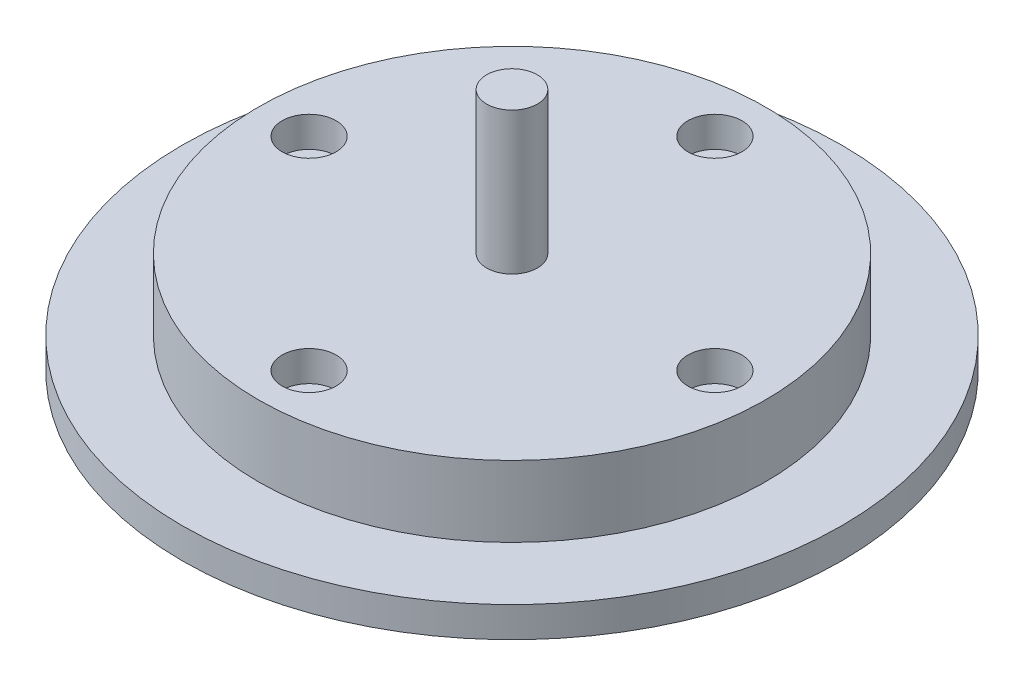
ISO-10303-21;
HEADER;
FILE_DESCRIPTION(('STEP AP214'),'2;1');
FILE_NAME('part.step','',(''),(''),'','','');
FILE_SCHEMA(('AUTOMOTIVE_DESIGN { 1 0 10303 214 1 1 1 1 }'));
ENDSEC;
DATA;
#1=APPLICATION_CONTEXT('core data for automotive mechanical design processes');
#2=APPLICATION_PROTOCOL_DEFINITION('international standard','automotive_design',2000,#1);
#3=PRODUCT_CONTEXT('',#1,'mechanical');
#4=PRODUCT('Part','Part','',(#3));
#5=PRODUCT_RELATED_PRODUCT_CATEGORY('part','',(#4));
#6=PRODUCT_DEFINITION_FORMATION('','',#4);
#7=PRODUCT_DEFINITION_CONTEXT('part definition',#1,'design');
#8=PRODUCT_DEFINITION('design','',#6,#7);
#9=PRODUCT_DEFINITION_SHAPE('','',#8);
#10=(LENGTH_UNIT() NAMED_UNIT(*) SI_UNIT(.MILLI.,.METRE.));
#11=(NAMED_UNIT(*) PLANE_ANGLE_UNIT() SI_UNIT($,.RADIAN.));
#12=(NAMED_UNIT(*) SI_UNIT($,.STERADIAN.) SOLID_ANGLE_UNIT());
#13=UNCERTAINTY_MEASURE_WITH_UNIT(LENGTH_MEASURE(1.E-05),#10,'distance_accuracy_value','');
#14=(GEOMETRIC_REPRESENTATION_CONTEXT(3) GLOBAL_UNCERTAINTY_ASSIGNED_CONTEXT((#13)) GLOBAL_UNIT_ASSIGNED_CONTEXT((#10,
#11,#12)) REPRESENTATION_CONTEXT('',''));
#15=CARTESIAN_POINT('',(0.,0.,0.));
#16=DIRECTION('',(0.,0.,1.));
#17=DIRECTION('',(1.,0.,0.));
#18=AXIS2_PLACEMENT_3D('',#15,#16,#17);
#19=CARTESIAN_POINT('',(0.,7.,-20.));
#20=DIRECTION('',(0.,-1.,0.));
#21=DIRECTION('',(0.,0.,-1.));
#22=AXIS2_PLACEMENT_3D('',#19,#20,#21);
#23=CYLINDRICAL_SURFACE('',#22,1.5);
#24=CARTESIAN_POINT('',(0.,4.,-20.));
#25=DIRECTION('',(0.,1.,0.));
#26=DIRECTION('',(0.,0.,1.));
#27=AXIS2_PLACEMENT_3D('',#24,#25,#26);
#28=CIRCLE('',#27,1.5);
#29=CARTESIAN_POINT('',(0.,4.,-18.5));
#30=VERTEX_POINT('',#29);
#31=EDGE_CURVE('E64',#30,#30,#28,.T.);
#32=ORIENTED_EDGE('',*,*,#31,.T.);
#33=EDGE_LOOP('',(#32));
#34=FACE_BOUND('',#33,.T.);
#35=CARTESIAN_POINT('',(0.,-3.,-20.));
#36=DIRECTION('',(0.,1.,0.));
#37=DIRECTION('',(0.,0.,1.));
#38=AXIS2_PLACEMENT_3D('',#35,#36,#37);
#39=CIRCLE('',#38,1.5);
#40=CARTESIAN_POINT('',(0.,-3.,-18.5));
#41=VERTEX_POINT('',#40);
#42=EDGE_CURVE('E84',#41,#41,#39,.T.);
#43=ORIENTED_EDGE('',*,*,#42,.F.);
#44=EDGE_LOOP('',(#43));
#45=FACE_BOUND('',#44,.T.);
#46=ADVANCED_FACE('F33',(#34,#45),#23,.F.);
#47=CARTESIAN_POINT('',(20.0000000000006,7.,-5.65984895009785E-13));
#48=DIRECTION('',(0.,-1.,0.));
#49=DIRECTION('',(0.,0.,-1.));
#50=AXIS2_PLACEMENT_3D('',#47,#48,#49);
#51=CYLINDRICAL_SURFACE('',#50,1.50000000000044);
#52=CARTESIAN_POINT('',(20.0000000000006,4.,-5.65984895009785E-13));
#53=DIRECTION('',(0.,1.,0.));
#54=DIRECTION('',(0.,0.,1.));
#55=AXIS2_PLACEMENT_3D('',#52,#53,#54);
#56=CIRCLE('',#55,1.50000000000044);
#57=CARTESIAN_POINT('',(20.0000000000006,4.,1.49999999999988));
#58=VERTEX_POINT('',#57);
#59=EDGE_CURVE('E55',#58,#58,#56,.T.);
#60=ORIENTED_EDGE('',*,*,#59,.T.);
#61=EDGE_LOOP('',(#60));
#62=FACE_BOUND('',#61,.T.);
#63=CARTESIAN_POINT('',(20.0000000000006,-3.,-5.65984895009785E-13));
#64=DIRECTION('',(0.,1.,0.));
#65=DIRECTION('',(0.,0.,1.));
#66=AXIS2_PLACEMENT_3D('',#63,#64,#65);
#67=CIRCLE('',#66,1.50000000000044);
#68=CARTESIAN_POINT('',(20.0000000000006,-3.,1.49999999999988));
#69=VERTEX_POINT('',#68);
#70=EDGE_CURVE('E95',#69,#69,#67,.T.);
#71=ORIENTED_EDGE('',*,*,#70,.F.);
#72=EDGE_LOOP('',(#71));
#73=FACE_BOUND('',#72,.T.);
#74=ADVANCED_FACE('F145',(#62,#73),#51,.F.);
#75=CARTESIAN_POINT('',(1.13196979001957E-12,7.,20.));
#76=DIRECTION('',(0.,-1.,0.));
#77=DIRECTION('',(0.,0.,-1.));
#78=AXIS2_PLACEMENT_3D('',#75,#76,#77);
#79=CYLINDRICAL_SURFACE('',#78,1.50000000000122);
#80=CARTESIAN_POINT('',(1.13196979001957E-12,4.,20.));
#81=DIRECTION('',(0.,1.,0.));
#82=DIRECTION('',(0.,0.,1.));
#83=AXIS2_PLACEMENT_3D('',#80,#81,#82);
#84=CIRCLE('',#83,1.50000000000122);
#85=CARTESIAN_POINT('',(1.13196979001957E-12,4.,21.5000000000012));
#86=VERTEX_POINT('',#85);
#87=EDGE_CURVE('E52',#86,#86,#84,.T.);
#88=ORIENTED_EDGE('',*,*,#87,.T.);
#89=EDGE_LOOP('',(#88));
#90=FACE_BOUND('',#89,.T.);
#91=CARTESIAN_POINT('',(1.13196979001957E-12,-3.,20.));
#92=DIRECTION('',(0.,1.,0.));
#93=DIRECTION('',(0.,0.,1.));
#94=AXIS2_PLACEMENT_3D('',#91,#92,#93);
#95=CIRCLE('',#94,1.50000000000122);
#96=CARTESIAN_POINT('',(1.13196979001957E-12,-3.,21.5000000000012));
#97=VERTEX_POINT('',#96);
#98=EDGE_CURVE('E92',#97,#97,#95,.T.);
#99=ORIENTED_EDGE('',*,*,#98,.F.);
#100=EDGE_LOOP('',(#99));
#101=FACE_BOUND('',#100,.T.);
#102=ADVANCED_FACE('F152',(#90,#101),#79,.F.);
#103=CARTESIAN_POINT('',(-19.9999999999994,7.,5.6843418860808E-13));
#104=DIRECTION('',(0.,-1.,0.));
#105=DIRECTION('',(0.,0.,-1.));
#106=AXIS2_PLACEMENT_3D('',#103,#104,#105);
#107=CYLINDRICAL_SURFACE('',#106,1.50000000000091);
#108=CARTESIAN_POINT('',(-19.9999999999994,4.,5.6843418860808E-13));
#109=DIRECTION('',(0.,1.,0.));
#110=DIRECTION('',(0.,0.,1.));
#111=AXIS2_PLACEMENT_3D('',#108,#109,#110);
#112=CIRCLE('',#111,1.50000000000091);
#113=CARTESIAN_POINT('',(-19.9999999999994,4.,1.50000000000148));
#114=VERTEX_POINT('',#113);
#115=EDGE_CURVE('E73',#114,#114,#112,.T.);
#116=ORIENTED_EDGE('',*,*,#115,.T.);
#117=EDGE_LOOP('',(#116));
#118=FACE_BOUND('',#117,.T.);
#119=CARTESIAN_POINT('',(-19.9999999999994,-3.,5.6843418860808E-13));
#120=DIRECTION('',(0.,1.,0.));
#121=DIRECTION('',(0.,0.,1.));
#122=AXIS2_PLACEMENT_3D('',#119,#120,#121);
#123=CIRCLE('',#122,1.50000000000091);
#124=CARTESIAN_POINT('',(-19.9999999999994,-3.,1.50000000000148));
#125=VERTEX_POINT('',#124);
#126=EDGE_CURVE('E89',#125,#125,#123,.T.);
#127=ORIENTED_EDGE('',*,*,#126,.F.);
#128=EDGE_LOOP('',(#127));
#129=FACE_BOUND('',#128,.T.);
#130=ADVANCED_FACE('F117',(#118,#129),#107,.F.);
#131=CARTESIAN_POINT('',(0.,7.,0.));
#132=DIRECTION('',(0.,1.,0.));
#133=DIRECTION('',(0.,0.,1.));
#134=AXIS2_PLACEMENT_3D('',#131,#132,#133);
#135=PLANE('',#134);
#136=CARTESIAN_POINT('',(0.,7.,0.));
#137=DIRECTION('',(0.,1.,0.));
#138=DIRECTION('',(0.,0.,1.));
#139=AXIS2_PLACEMENT_3D('',#136,#137,#138);
#140=CIRCLE('',#139,2.5);
#141=CARTESIAN_POINT('',(0.,7.,2.5));
#142=VERTEX_POINT('',#141);
#143=EDGE_CURVE('E99',#142,#142,#140,.T.);
#144=ORIENTED_EDGE('',*,*,#143,.F.);
#145=EDGE_LOOP('',(#144));
#146=FACE_BOUND('',#145,.T.);
#147=CARTESIAN_POINT('',(-19.9999999999994,7.,5.6843418860808E-13));
#148=DIRECTION('',(0.,1.,0.));
#149=DIRECTION('',(0.,0.,1.));
#150=AXIS2_PLACEMENT_3D('',#147,#148,#149);
#151=CIRCLE('',#150,2.66);
#152=CARTESIAN_POINT('',(-19.9999999999994,7.,2.66000000000057));
#153=VERTEX_POINT('',#152);
#154=EDGE_CURVE('E45',#153,#153,#151,.T.);
#155=ORIENTED_EDGE('',*,*,#154,.F.);
#156=EDGE_LOOP('',(#155));
#157=FACE_BOUND('',#156,.T.);
#158=CARTESIAN_POINT('',(-4.98604561831219E-13,7.,-19.9999999999994));
#159=DIRECTION('',(0.,1.,0.));
#160=DIRECTION('',(0.,0.,1.));
#161=AXIS2_PLACEMENT_3D('',#158,#159,#160);
#162=CIRCLE('',#161,2.66);
#163=CARTESIAN_POINT('',(-4.98604561831219E-13,7.,-17.3399999999994));
#164=VERTEX_POINT('',#163);
#165=EDGE_CURVE('E67',#164,#164,#162,.T.);
#166=ORIENTED_EDGE('',*,*,#165,.F.);
#167=EDGE_LOOP('',(#166));
#168=FACE_BOUND('',#167,.T.);
#169=CARTESIAN_POINT('',(19.9999999999994,7.,-4.28774935054359E-13));
#170=DIRECTION('',(0.,1.,0.));
#171=DIRECTION('',(0.,0.,1.));
#172=AXIS2_PLACEMENT_3D('',#169,#170,#171);
#173=CIRCLE('',#172,2.66);
#174=CARTESIAN_POINT('',(19.9999999999994,7.,2.65999999999957));
#175=VERTEX_POINT('',#174);
#176=EDGE_CURVE('E58',#175,#175,#173,.T.);
#177=ORIENTED_EDGE('',*,*,#176,.F.);
#178=EDGE_LOOP('',(#177));
#179=FACE_BOUND('',#178,.T.);
#180=CARTESIAN_POINT('',(3.55475861325544E-13,7.,19.9999999999994));
#181=DIRECTION('',(0.,1.,0.));
#182=DIRECTION('',(0.,0.,1.));
#183=AXIS2_PLACEMENT_3D('',#180,#181,#182);
#184=CIRCLE('',#183,2.66);
#185=CARTESIAN_POINT('',(3.55475861325544E-13,7.,22.6599999999994));
#186=VERTEX_POINT('',#185);
#187=EDGE_CURVE('E48',#186,#186,#184,.T.);
#188=ORIENTED_EDGE('',*,*,#187,.F.);
#189=EDGE_LOOP('',(#188));
#190=FACE_BOUND('',#189,.T.);
#191=CARTESIAN_POINT('',(0.,7.,0.));
#192=DIRECTION('',(0.,1.,0.));
#193=DIRECTION('',(0.,0.,1.));
#194=AXIS2_PLACEMENT_3D('',#191,#192,#193);
#195=CIRCLE('',#194,25.);
#196=CARTESIAN_POINT('',(0.,7.,25.));
#197=VERTEX_POINT('',#196);
#198=EDGE_CURVE('E10',#197,#197,#195,.T.);
#199=ORIENTED_EDGE('',*,*,#198,.T.);
#200=EDGE_LOOP('',(#199));
#201=FACE_BOUND('',#200,.T.);
#202=ADVANCED_FACE('F114',(#146,#157,#168,#179,#190,#201),#135,.T.);
#203=CARTESIAN_POINT('',(0.,7.,0.));
#204=DIRECTION('',(0.,-1.,0.));
#205=DIRECTION('',(0.,0.,-1.));
#206=AXIS2_PLACEMENT_3D('',#203,#204,#205);
#207=CYLINDRICAL_SURFACE('',#206,25.);
#208=ORIENTED_EDGE('',*,*,#198,.F.);
#209=EDGE_LOOP('',(#208));
#210=FACE_BOUND('',#209,.T.);
#211=CARTESIAN_POINT('',(0.,0.,0.));
#212=DIRECTION('',(0.,1.,0.));
#213=DIRECTION('',(0.,0.,1.));
#214=AXIS2_PLACEMENT_3D('',#211,#212,#213);
#215=CIRCLE('',#214,25.);
#216=CARTESIAN_POINT('',(0.,0.,25.));
#217=VERTEX_POINT('',#216);
#218=EDGE_CURVE('E37',#217,#217,#215,.T.);
#219=ORIENTED_EDGE('',*,*,#218,.T.);
#220=EDGE_LOOP('',(#219));
#221=FACE_BOUND('',#220,.T.);
#222=ADVANCED_FACE('F35',(#210,#221),#207,.T.);
#223=CARTESIAN_POINT('',(-19.9999999999994,4.,5.6843418860808E-13));
#224=DIRECTION('',(0.,1.,0.));
#225=DIRECTION('',(0.,0.,1.));
#226=AXIS2_PLACEMENT_3D('',#223,#224,#225);
#227=CYLINDRICAL_SURFACE('',#226,2.66);
#228=CARTESIAN_POINT('',(-19.9999999999994,4.,5.6843418860808E-13));
#229=DIRECTION('',(0.,1.,0.));
#230=DIRECTION('',(0.,0.,1.));
#231=AXIS2_PLACEMENT_3D('',#228,#229,#230);
#232=CIRCLE('',#231,2.66);
#233=CARTESIAN_POINT('',(-19.9999999999994,4.,2.66000000000057));
#234=VERTEX_POINT('',#233);
#235=EDGE_CURVE('E41',#234,#234,#232,.T.);
#236=ORIENTED_EDGE('',*,*,#235,.F.);
#237=EDGE_LOOP('',(#236));
#238=FACE_BOUND('',#237,.T.);
#239=ORIENTED_EDGE('',*,*,#154,.T.);
#240=EDGE_LOOP('',(#239));
#241=FACE_BOUND('',#240,.T.);
#242=ADVANCED_FACE('F139',(#238,#241),#227,.F.);
#243=CARTESIAN_POINT('',(-19.9999999999994,4.,5.6843418860808E-13));
#244=DIRECTION('',(0.,1.,0.));
#245=DIRECTION('',(0.,0.,1.));
#246=AXIS2_PLACEMENT_3D('',#243,#244,#245);
#247=PLANE('',#246);
#248=ORIENTED_EDGE('',*,*,#115,.F.);
#249=EDGE_LOOP('',(#248));
#250=FACE_BOUND('',#249,.T.);
#251=ORIENTED_EDGE('',*,*,#235,.T.);
#252=EDGE_LOOP('',(#251));
#253=FACE_BOUND('',#252,.T.);
#254=ADVANCED_FACE('F129',(#250,#253),#247,.T.);
#255=CARTESIAN_POINT('',(3.55475861325544E-13,4.,19.9999999999994));
#256=DIRECTION('',(0.,1.,0.));
#257=DIRECTION('',(0.,0.,1.));
#258=AXIS2_PLACEMENT_3D('',#255,#256,#257);
#259=CYLINDRICAL_SURFACE('',#258,2.66);
#260=CARTESIAN_POINT('',(3.55475861325544E-13,4.,19.9999999999994));
#261=DIRECTION('',(0.,1.,0.));
#262=DIRECTION('',(0.,0.,1.));
#263=AXIS2_PLACEMENT_3D('',#260,#261,#262);
#264=CIRCLE('',#263,2.66);
#265=CARTESIAN_POINT('',(3.55475861325544E-13,4.,22.6599999999994));
#266=VERTEX_POINT('',#265);
#267=EDGE_CURVE('E51',#266,#266,#264,.T.);
#268=ORIENTED_EDGE('',*,*,#267,.F.);
#269=EDGE_LOOP('',(#268));
#270=FACE_BOUND('',#269,.T.);
#271=ORIENTED_EDGE('',*,*,#187,.T.);
#272=EDGE_LOOP('',(#271));
#273=FACE_BOUND('',#272,.T.);
#274=ADVANCED_FACE('F126',(#270,#273),#259,.F.);
#275=CARTESIAN_POINT('',(3.55475861325544E-13,4.,19.9999999999994));
#276=DIRECTION('',(0.,1.,0.));
#277=DIRECTION('',(0.,0.,1.));
#278=AXIS2_PLACEMENT_3D('',#275,#276,#277);
#279=PLANE('',#278);
#280=ORIENTED_EDGE('',*,*,#87,.F.);
#281=EDGE_LOOP('',(#280));
#282=FACE_BOUND('',#281,.T.);
#283=ORIENTED_EDGE('',*,*,#267,.T.);
#284=EDGE_LOOP('',(#283));
#285=FACE_BOUND('',#284,.T.);
#286=ADVANCED_FACE('F128',(#282,#285),#279,.T.);
#287=CARTESIAN_POINT('',(19.9999999999994,4.,-4.28774935054359E-13));
#288=DIRECTION('',(0.,1.,0.));
#289=DIRECTION('',(0.,0.,1.));
#290=AXIS2_PLACEMENT_3D('',#287,#288,#289);
#291=CYLINDRICAL_SURFACE('',#290,2.66);
#292=CARTESIAN_POINT('',(19.9999999999994,4.,-4.28774935054359E-13));
#293=DIRECTION('',(0.,1.,0.));
#294=DIRECTION('',(0.,0.,1.));
#295=AXIS2_PLACEMENT_3D('',#292,#293,#294);
#296=CIRCLE('',#295,2.66);
#297=CARTESIAN_POINT('',(19.9999999999994,4.,2.65999999999957));
#298=VERTEX_POINT('',#297);
#299=EDGE_CURVE('E61',#298,#298,#296,.T.);
#300=ORIENTED_EDGE('',*,*,#299,.F.);
#301=EDGE_LOOP('',(#300));
#302=FACE_BOUND('',#301,.T.);
#303=ORIENTED_EDGE('',*,*,#176,.T.);
#304=EDGE_LOOP('',(#303));
#305=FACE_BOUND('',#304,.T.);
#306=ADVANCED_FACE('F136',(#302,#305),#291,.F.);
#307=CARTESIAN_POINT('',(19.9999999999994,4.,-4.28774935054359E-13));
#308=DIRECTION('',(0.,1.,0.));
#309=DIRECTION('',(0.,0.,1.));
#310=AXIS2_PLACEMENT_3D('',#307,#308,#309);
#311=PLANE('',#310);
#312=ORIENTED_EDGE('',*,*,#59,.F.);
#313=EDGE_LOOP('',(#312));
#314=FACE_BOUND('',#313,.T.);
#315=ORIENTED_EDGE('',*,*,#299,.T.);
#316=EDGE_LOOP('',(#315));
#317=FACE_BOUND('',#316,.T.);
#318=ADVANCED_FACE('F198',(#314,#317),#311,.T.);
#319=CARTESIAN_POINT('',(-4.98604561831219E-13,4.,-19.9999999999994));
#320=DIRECTION('',(0.,1.,0.));
#321=DIRECTION('',(0.,0.,1.));
#322=AXIS2_PLACEMENT_3D('',#319,#320,#321);
#323=CYLINDRICAL_SURFACE('',#322,2.66);
#324=CARTESIAN_POINT('',(-4.98604561831219E-13,4.,-19.9999999999994));
#325=DIRECTION('',(0.,1.,0.));
#326=DIRECTION('',(0.,0.,1.));
#327=AXIS2_PLACEMENT_3D('',#324,#325,#326);
#328=CIRCLE('',#327,2.66);
#329=CARTESIAN_POINT('',(-4.98604561831219E-13,4.,-17.3399999999994));
#330=VERTEX_POINT('',#329);
#331=EDGE_CURVE('E70',#330,#330,#328,.T.);
#332=ORIENTED_EDGE('',*,*,#331,.F.);
#333=EDGE_LOOP('',(#332));
#334=FACE_BOUND('',#333,.T.);
#335=ORIENTED_EDGE('',*,*,#165,.T.);
#336=EDGE_LOOP('',(#335));
#337=FACE_BOUND('',#336,.T.);
#338=ADVANCED_FACE('F194',(#334,#337),#323,.F.);
#339=CARTESIAN_POINT('',(-4.98604561831219E-13,4.,-19.9999999999994));
#340=DIRECTION('',(0.,1.,0.));
#341=DIRECTION('',(0.,0.,1.));
#342=AXIS2_PLACEMENT_3D('',#339,#340,#341);
#343=PLANE('',#342);
#344=ORIENTED_EDGE('',*,*,#31,.F.);
#345=EDGE_LOOP('',(#344));
#346=FACE_BOUND('',#345,.T.);
#347=ORIENTED_EDGE('',*,*,#331,.T.);
#348=EDGE_LOOP('',(#347));
#349=FACE_BOUND('',#348,.T.);
#350=ADVANCED_FACE('F179',(#346,#349),#343,.T.);
#351=CARTESIAN_POINT('',(0.,-3.,0.));
#352=DIRECTION('',(0.,1.,0.));
#353=DIRECTION('',(0.,0.,1.));
#354=AXIS2_PLACEMENT_3D('',#351,#352,#353);
#355=CYLINDRICAL_SURFACE('',#354,32.5);
#356=CARTESIAN_POINT('',(0.,-3.,0.));
#357=DIRECTION('',(0.,1.,0.));
#358=DIRECTION('',(0.,0.,1.));
#359=AXIS2_PLACEMENT_3D('',#356,#357,#358);
#360=CIRCLE('',#359,32.5);
#361=CARTESIAN_POINT('',(0.,-3.,32.5));
#362=VERTEX_POINT('',#361);
#363=EDGE_CURVE('E83',#362,#362,#360,.T.);
#364=ORIENTED_EDGE('',*,*,#363,.T.);
#365=EDGE_LOOP('',(#364));
#366=FACE_BOUND('',#365,.T.);
#367=CARTESIAN_POINT('',(0.,0.,0.));
#368=DIRECTION('',(0.,1.,0.));
#369=DIRECTION('',(0.,0.,1.));
#370=AXIS2_PLACEMENT_3D('',#367,#368,#369);
#371=CIRCLE('',#370,32.5);
#372=CARTESIAN_POINT('',(0.,0.,32.5));
#373=VERTEX_POINT('',#372);
#374=EDGE_CURVE('E80',#373,#373,#371,.T.);
#375=ORIENTED_EDGE('',*,*,#374,.F.);
#376=EDGE_LOOP('',(#375));
#377=FACE_BOUND('',#376,.T.);
#378=ADVANCED_FACE('F171',(#366,#377),#355,.T.);
#379=CARTESIAN_POINT('',(0.,-3.,0.));
#380=DIRECTION('',(0.,1.,0.));
#381=DIRECTION('',(0.,0.,1.));
#382=AXIS2_PLACEMENT_3D('',#379,#380,#381);
#383=PLANE('',#382);
#384=ORIENTED_EDGE('',*,*,#70,.T.);
#385=EDGE_LOOP('',(#384));
#386=FACE_BOUND('',#385,.T.);
#387=ORIENTED_EDGE('',*,*,#98,.T.);
#388=EDGE_LOOP('',(#387));
#389=FACE_BOUND('',#388,.T.);
#390=ORIENTED_EDGE('',*,*,#126,.T.);
#391=EDGE_LOOP('',(#390));
#392=FACE_BOUND('',#391,.T.);
#393=ORIENTED_EDGE('',*,*,#42,.T.);
#394=EDGE_LOOP('',(#393));
#395=FACE_BOUND('',#394,.T.);
#396=ORIENTED_EDGE('',*,*,#363,.F.);
#397=EDGE_LOOP('',(#396));
#398=FACE_BOUND('',#397,.T.);
#399=ADVANCED_FACE('F168',(#386,#389,#392,#395,#398),#383,.F.);
#400=CARTESIAN_POINT('',(0.,0.,0.));
#401=DIRECTION('',(0.,1.,0.));
#402=DIRECTION('',(0.,0.,1.));
#403=AXIS2_PLACEMENT_3D('',#400,#401,#402);
#404=PLANE('',#403);
#405=ORIENTED_EDGE('',*,*,#218,.F.);
#406=EDGE_LOOP('',(#405));
#407=FACE_BOUND('',#406,.T.);
#408=ORIENTED_EDGE('',*,*,#374,.T.);
#409=EDGE_LOOP('',(#408));
#410=FACE_BOUND('',#409,.T.);
#411=ADVANCED_FACE('F110',(#407,#410),#404,.T.);
#412=CARTESIAN_POINT('',(0.,21.,0.));
#413=DIRECTION('',(0.,-1.,0.));
#414=DIRECTION('',(0.,0.,-1.));
#415=AXIS2_PLACEMENT_3D('',#412,#413,#414);
#416=CYLINDRICAL_SURFACE('',#415,2.5);
#417=CARTESIAN_POINT('',(0.,21.,0.));
#418=DIRECTION('',(0.,1.,0.));
#419=DIRECTION('',(0.,0.,1.));
#420=AXIS2_PLACEMENT_3D('',#417,#418,#419);
#421=CIRCLE('',#420,2.5);
#422=CARTESIAN_POINT('',(0.,21.,2.5));
#423=VERTEX_POINT('',#422);
#424=EDGE_CURVE('E98',#423,#423,#421,.T.);
#425=ORIENTED_EDGE('',*,*,#424,.F.);
#426=EDGE_LOOP('',(#425));
#427=FACE_BOUND('',#426,.T.);
#428=ORIENTED_EDGE('',*,*,#143,.T.);
#429=EDGE_LOOP('',(#428));
#430=FACE_BOUND('',#429,.T.);
#431=ADVANCED_FACE('F107',(#427,#430),#416,.T.);
#432=CARTESIAN_POINT('',(0.,21.,0.));
#433=DIRECTION('',(0.,1.,0.));
#434=DIRECTION('',(0.,0.,1.));
#435=AXIS2_PLACEMENT_3D('',#432,#433,#434);
#436=PLANE('',#435);
#437=ORIENTED_EDGE('',*,*,#424,.T.);
#438=EDGE_LOOP('',(#437));
#439=FACE_BOUND('',#438,.T.);
#440=ADVANCED_FACE('F105',(#439),#436,.T.);
#441=CLOSED_SHELL('',(#46,#74,#102,#130,#202,#222,#242,#254,#274,#286,#306,#318,#338,#350,#378,
#399,#411,#431,#440));
#442=MANIFOLD_SOLID_BREP('B2',#441);
#443=ADVANCED_BREP_SHAPE_REPRESENTATION('',(#18,#442),#14);
#444=SHAPE_DEFINITION_REPRESENTATION(#9,#443);
ENDSEC;
END-ISO-10303-21;
